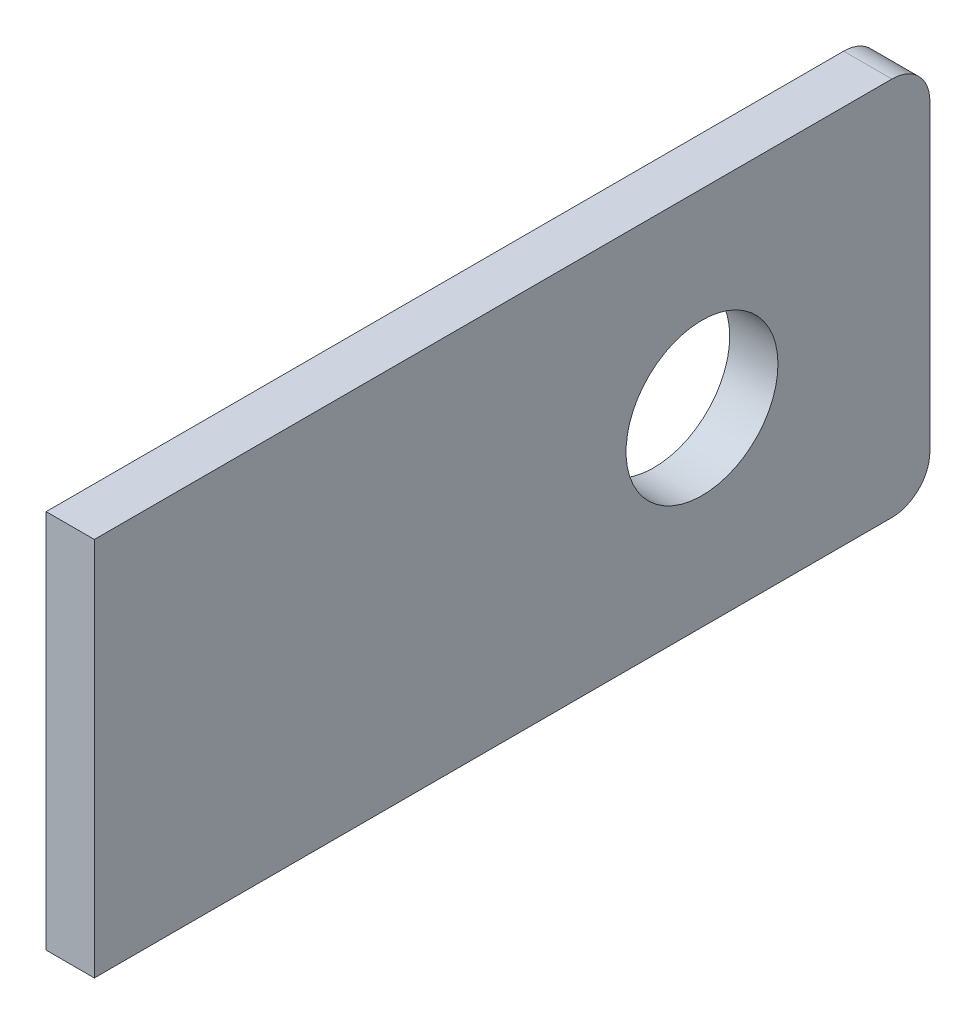
ISO-10303-21;
HEADER;
FILE_DESCRIPTION(('STEP AP214'),'2;1');
FILE_NAME('part.step','',(''),(''),'','','');
FILE_SCHEMA(('AUTOMOTIVE_DESIGN { 1 0 10303 214 1 1 1 1 }'));
ENDSEC;
DATA;
#1=APPLICATION_CONTEXT('core data for automotive mechanical design processes');
#2=APPLICATION_PROTOCOL_DEFINITION('international standard','automotive_design',2000,#1);
#3=PRODUCT_CONTEXT('',#1,'mechanical');
#4=PRODUCT('Part','Part','',(#3));
#5=PRODUCT_RELATED_PRODUCT_CATEGORY('part','',(#4));
#6=PRODUCT_DEFINITION_FORMATION('','',#4);
#7=PRODUCT_DEFINITION_CONTEXT('part definition',#1,'design');
#8=PRODUCT_DEFINITION('design','',#6,#7);
#9=PRODUCT_DEFINITION_SHAPE('','',#8);
#10=(LENGTH_UNIT() NAMED_UNIT(*) SI_UNIT(.MILLI.,.METRE.));
#11=(NAMED_UNIT(*) PLANE_ANGLE_UNIT() SI_UNIT($,.RADIAN.));
#12=(NAMED_UNIT(*) SI_UNIT($,.STERADIAN.) SOLID_ANGLE_UNIT());
#13=UNCERTAINTY_MEASURE_WITH_UNIT(LENGTH_MEASURE(1.E-05),#10,'distance_accuracy_value','');
#14=(GEOMETRIC_REPRESENTATION_CONTEXT(3) GLOBAL_UNCERTAINTY_ASSIGNED_CONTEXT((#13)) GLOBAL_UNIT_ASSIGNED_CONTEXT((#10,
#11,#12)) REPRESENTATION_CONTEXT('',''));
#15=CARTESIAN_POINT('',(0.,0.,0.));
#16=DIRECTION('',(0.,0.,1.));
#17=DIRECTION('',(1.,0.,0.));
#18=AXIS2_PLACEMENT_3D('',#15,#16,#17);
#19=CARTESIAN_POINT('',(3.175,0.,0.));
#20=DIRECTION('',(1.,0.,0.));
#21=DIRECTION('',(0.,0.,-1.));
#22=AXIS2_PLACEMENT_3D('',#19,#20,#21);
#23=PLANE('',#22);
#24=DIRECTION('',(0.,0.,-1.));
#25=VECTOR('',#24,1.);
#26=CARTESIAN_POINT('',(3.175,-25.,80.));
#27=LINE('',#26,#25);
#28=CARTESIAN_POINT('',(3.175,-25.,80.));
#29=VERTEX_POINT('',#28);
#30=CARTESIAN_POINT('',(3.175,-25.,-25.));
#31=VERTEX_POINT('',#30);
#32=EDGE_CURVE('E110',#29,#31,#27,.T.);
#33=ORIENTED_EDGE('',*,*,#32,.T.);
#34=CARTESIAN_POINT('',(3.175,-20.,-25.));
#35=DIRECTION('',(1.,0.,0.));
#36=DIRECTION('',(0.,0.,-1.));
#37=AXIS2_PLACEMENT_3D('',#34,#35,#36);
#38=CIRCLE('',#37,5.);
#39=CARTESIAN_POINT('',(3.175,-20.,-30.));
#40=VERTEX_POINT('',#39);
#41=EDGE_CURVE('E43',#31,#40,#38,.T.);
#42=ORIENTED_EDGE('',*,*,#41,.T.);
#43=DIRECTION('',(0.,1.,0.));
#44=VECTOR('',#43,1.);
#45=CARTESIAN_POINT('',(3.175,25.,-30.));
#46=LINE('',#45,#44);
#47=CARTESIAN_POINT('',(3.175,20.,-30.));
#48=VERTEX_POINT('',#47);
#49=EDGE_CURVE('E96',#40,#48,#46,.T.);
#50=ORIENTED_EDGE('',*,*,#49,.T.);
#51=CARTESIAN_POINT('',(3.175,20.,-25.));
#52=DIRECTION('',(1.,0.,0.));
#53=DIRECTION('',(0.,0.,-1.));
#54=AXIS2_PLACEMENT_3D('',#51,#52,#53);
#55=CIRCLE('',#54,5.);
#56=CARTESIAN_POINT('',(3.175,25.,-25.));
#57=VERTEX_POINT('',#56);
#58=EDGE_CURVE('E50',#48,#57,#55,.T.);
#59=ORIENTED_EDGE('',*,*,#58,.T.);
#60=DIRECTION('',(0.,0.,1.));
#61=VECTOR('',#60,1.);
#62=CARTESIAN_POINT('',(3.175,25.,80.));
#63=LINE('',#62,#61);
#64=CARTESIAN_POINT('',(3.175,25.,80.));
#65=VERTEX_POINT('',#64);
#66=EDGE_CURVE('E88',#57,#65,#63,.T.);
#67=ORIENTED_EDGE('',*,*,#66,.T.);
#68=DIRECTION('',(0.,-1.,0.));
#69=VECTOR('',#68,1.);
#70=CARTESIAN_POINT('',(3.175,25.,80.));
#71=LINE('',#70,#69);
#72=EDGE_CURVE('E92',#65,#29,#71,.T.);
#73=ORIENTED_EDGE('',*,*,#72,.T.);
#74=EDGE_LOOP('',(#33,#42,#50,#59,#67,#73));
#75=FACE_BOUND('',#74,.T.);
#76=CARTESIAN_POINT('',(3.175,0.,0.));
#77=DIRECTION('',(1.,0.,0.));
#78=DIRECTION('',(0.,0.,-1.));
#79=AXIS2_PLACEMENT_3D('',#76,#77,#78);
#80=CIRCLE('',#79,10.);
#81=CARTESIAN_POINT('',(3.175,0.,-10.));
#82=VERTEX_POINT('',#81);
#83=EDGE_CURVE('E118',#82,#82,#80,.T.);
#84=ORIENTED_EDGE('',*,*,#83,.F.);
#85=EDGE_LOOP('',(#84));
#86=FACE_BOUND('',#85,.T.);
#87=ADVANCED_FACE('F35',(#75,#86),#23,.T.);
#88=CARTESIAN_POINT('',(-3.175,0.,0.));
#89=DIRECTION('',(1.,0.,0.));
#90=DIRECTION('',(0.,0.,-1.));
#91=AXIS2_PLACEMENT_3D('',#88,#89,#90);
#92=PLANE('',#91);
#93=DIRECTION('',(0.,1.,0.));
#94=VECTOR('',#93,1.);
#95=CARTESIAN_POINT('',(-3.175,25.,-30.));
#96=LINE('',#95,#94);
#97=CARTESIAN_POINT('',(-3.175,-20.,-30.));
#98=VERTEX_POINT('',#97);
#99=CARTESIAN_POINT('',(-3.175,20.,-30.));
#100=VERTEX_POINT('',#99);
#101=EDGE_CURVE('E115',#98,#100,#96,.T.);
#102=ORIENTED_EDGE('',*,*,#101,.F.);
#103=CARTESIAN_POINT('',(-3.175,-20.,-25.));
#104=DIRECTION('',(1.,0.,0.));
#105=DIRECTION('',(0.,0.,-1.));
#106=AXIS2_PLACEMENT_3D('',#103,#104,#105);
#107=CIRCLE('',#106,5.);
#108=CARTESIAN_POINT('',(-3.175,-25.,-25.));
#109=VERTEX_POINT('',#108);
#110=EDGE_CURVE('E131',#98,#109,#107,.F.);
#111=ORIENTED_EDGE('',*,*,#110,.T.);
#112=DIRECTION('',(0.,0.,-1.));
#113=VECTOR('',#112,1.);
#114=CARTESIAN_POINT('',(-3.175,-25.,80.));
#115=LINE('',#114,#113);
#116=CARTESIAN_POINT('',(-3.175,-25.,80.));
#117=VERTEX_POINT('',#116);
#118=EDGE_CURVE('E122',#117,#109,#115,.T.);
#119=ORIENTED_EDGE('',*,*,#118,.F.);
#120=DIRECTION('',(0.,-1.,0.));
#121=VECTOR('',#120,1.);
#122=CARTESIAN_POINT('',(-3.175,25.,80.));
#123=LINE('',#122,#121);
#124=CARTESIAN_POINT('',(-3.175,25.,80.));
#125=VERTEX_POINT('',#124);
#126=EDGE_CURVE('E120',#125,#117,#123,.T.);
#127=ORIENTED_EDGE('',*,*,#126,.F.);
#128=DIRECTION('',(0.,0.,1.));
#129=VECTOR('',#128,1.);
#130=CARTESIAN_POINT('',(-3.175,25.,80.));
#131=LINE('',#130,#129);
#132=CARTESIAN_POINT('',(-3.175,25.,-25.));
#133=VERTEX_POINT('',#132);
#134=EDGE_CURVE('E102',#133,#125,#131,.T.);
#135=ORIENTED_EDGE('',*,*,#134,.F.);
#136=CARTESIAN_POINT('',(-3.175,20.,-25.));
#137=DIRECTION('',(1.,0.,0.));
#138=DIRECTION('',(0.,0.,-1.));
#139=AXIS2_PLACEMENT_3D('',#136,#137,#138);
#140=CIRCLE('',#139,5.);
#141=EDGE_CURVE('E129',#133,#100,#140,.F.);
#142=ORIENTED_EDGE('',*,*,#141,.T.);
#143=EDGE_LOOP('',(#102,#111,#119,#127,#135,#142));
#144=FACE_BOUND('',#143,.T.);
#145=CARTESIAN_POINT('',(-3.175,0.,0.));
#146=DIRECTION('',(1.,0.,0.));
#147=DIRECTION('',(0.,0.,-1.));
#148=AXIS2_PLACEMENT_3D('',#145,#146,#147);
#149=CIRCLE('',#148,10.);
#150=CARTESIAN_POINT('',(-3.175,0.,-10.));
#151=VERTEX_POINT('',#150);
#152=EDGE_CURVE('E226',#151,#151,#149,.T.);
#153=ORIENTED_EDGE('',*,*,#152,.T.);
#154=EDGE_LOOP('',(#153));
#155=FACE_BOUND('',#154,.T.);
#156=ADVANCED_FACE('F145',(#144,#155),#92,.F.);
#157=CARTESIAN_POINT('',(3.175,25.,-30.));
#158=DIRECTION('',(0.,0.,1.));
#159=DIRECTION('',(0.,-1.,0.));
#160=AXIS2_PLACEMENT_3D('',#157,#158,#159);
#161=PLANE('',#160);
#162=ORIENTED_EDGE('',*,*,#49,.F.);
#163=DIRECTION('',(-1.,0.,0.));
#164=VECTOR('',#163,1.);
#165=CARTESIAN_POINT('',(3.175,-20.,-30.));
#166=LINE('',#165,#164);
#167=EDGE_CURVE('E126',#40,#98,#166,.T.);
#168=ORIENTED_EDGE('',*,*,#167,.T.);
#169=ORIENTED_EDGE('',*,*,#101,.T.);
#170=DIRECTION('',(-1.,0.,0.));
#171=VECTOR('',#170,1.);
#172=CARTESIAN_POINT('',(3.175,20.,-30.));
#173=LINE('',#172,#171);
#174=EDGE_CURVE('E105',#100,#48,#173,.F.);
#175=ORIENTED_EDGE('',*,*,#174,.T.);
#176=EDGE_LOOP('',(#162,#168,#169,#175));
#177=FACE_BOUND('',#176,.T.);
#178=ADVANCED_FACE('F139',(#177),#161,.F.);
#179=CARTESIAN_POINT('',(3.175,25.,80.));
#180=DIRECTION('',(0.,-1.,0.));
#181=DIRECTION('',(0.,0.,-1.));
#182=AXIS2_PLACEMENT_3D('',#179,#180,#181);
#183=PLANE('',#182);
#184=ORIENTED_EDGE('',*,*,#66,.F.);
#185=DIRECTION('',(-1.,0.,0.));
#186=VECTOR('',#185,1.);
#187=CARTESIAN_POINT('',(3.175,25.,-25.));
#188=LINE('',#187,#186);
#189=EDGE_CURVE('E11',#57,#133,#188,.T.);
#190=ORIENTED_EDGE('',*,*,#189,.T.);
#191=ORIENTED_EDGE('',*,*,#134,.T.);
#192=DIRECTION('',(-1.,0.,0.));
#193=VECTOR('',#192,1.);
#194=CARTESIAN_POINT('',(3.175,25.,80.));
#195=LINE('',#194,#193);
#196=EDGE_CURVE('E99',#65,#125,#195,.T.);
#197=ORIENTED_EDGE('',*,*,#196,.F.);
#198=EDGE_LOOP('',(#184,#190,#191,#197));
#199=FACE_BOUND('',#198,.T.);
#200=ADVANCED_FACE('F100',(#199),#183,.F.);
#201=CARTESIAN_POINT('',(3.175,25.,80.));
#202=DIRECTION('',(0.,0.,-1.));
#203=DIRECTION('',(-1.,0.,0.));
#204=AXIS2_PLACEMENT_3D('',#201,#202,#203);
#205=PLANE('',#204);
#206=ORIENTED_EDGE('',*,*,#126,.T.);
#207=DIRECTION('',(-1.,0.,0.));
#208=VECTOR('',#207,1.);
#209=CARTESIAN_POINT('',(3.175,-25.,80.));
#210=LINE('',#209,#208);
#211=EDGE_CURVE('E106',#29,#117,#210,.T.);
#212=ORIENTED_EDGE('',*,*,#211,.F.);
#213=ORIENTED_EDGE('',*,*,#72,.F.);
#214=ORIENTED_EDGE('',*,*,#196,.T.);
#215=EDGE_LOOP('',(#206,#212,#213,#214));
#216=FACE_BOUND('',#215,.T.);
#217=ADVANCED_FACE('F108',(#216),#205,.F.);
#218=CARTESIAN_POINT('',(3.175,-25.,80.));
#219=DIRECTION('',(0.,1.,0.));
#220=DIRECTION('',(0.,0.,1.));
#221=AXIS2_PLACEMENT_3D('',#218,#219,#220);
#222=PLANE('',#221);
#223=ORIENTED_EDGE('',*,*,#118,.T.);
#224=DIRECTION('',(-1.,0.,0.));
#225=VECTOR('',#224,1.);
#226=CARTESIAN_POINT('',(3.175,-25.,-25.));
#227=LINE('',#226,#225);
#228=EDGE_CURVE('E58',#109,#31,#227,.F.);
#229=ORIENTED_EDGE('',*,*,#228,.T.);
#230=ORIENTED_EDGE('',*,*,#32,.F.);
#231=ORIENTED_EDGE('',*,*,#211,.T.);
#232=EDGE_LOOP('',(#223,#229,#230,#231));
#233=FACE_BOUND('',#232,.T.);
#234=ADVANCED_FACE('F147',(#233),#222,.F.);
#235=CARTESIAN_POINT('',(3.175,0.,0.));
#236=DIRECTION('',(-1.,0.,0.));
#237=DIRECTION('',(0.,0.,1.));
#238=AXIS2_PLACEMENT_3D('',#235,#236,#237);
#239=CYLINDRICAL_SURFACE('',#238,10.);
#240=ORIENTED_EDGE('',*,*,#83,.T.);
#241=EDGE_LOOP('',(#240));
#242=FACE_BOUND('',#241,.T.);
#243=ORIENTED_EDGE('',*,*,#152,.F.);
#244=EDGE_LOOP('',(#243));
#245=FACE_BOUND('',#244,.T.);
#246=ADVANCED_FACE('F149',(#242,#245),#239,.F.);
#247=CARTESIAN_POINT('',(3.175,-20.,-25.));
#248=DIRECTION('',(-1.,0.,0.));
#249=DIRECTION('',(0.,0.,1.));
#250=AXIS2_PLACEMENT_3D('',#247,#248,#249);
#251=CYLINDRICAL_SURFACE('',#250,5.);
#252=ORIENTED_EDGE('',*,*,#41,.F.);
#253=ORIENTED_EDGE('',*,*,#228,.F.);
#254=ORIENTED_EDGE('',*,*,#110,.F.);
#255=ORIENTED_EDGE('',*,*,#167,.F.);
#256=EDGE_LOOP('',(#252,#253,#254,#255));
#257=FACE_BOUND('',#256,.T.);
#258=ADVANCED_FACE('F142',(#257),#251,.T.);
#259=CARTESIAN_POINT('',(3.175,20.,-25.));
#260=DIRECTION('',(-1.,0.,0.));
#261=DIRECTION('',(0.,0.,1.));
#262=AXIS2_PLACEMENT_3D('',#259,#260,#261);
#263=CYLINDRICAL_SURFACE('',#262,5.);
#264=ORIENTED_EDGE('',*,*,#58,.F.);
#265=ORIENTED_EDGE('',*,*,#174,.F.);
#266=ORIENTED_EDGE('',*,*,#141,.F.);
#267=ORIENTED_EDGE('',*,*,#189,.F.);
#268=EDGE_LOOP('',(#264,#265,#266,#267));
#269=FACE_BOUND('',#268,.T.);
#270=ADVANCED_FACE('F37',(#269),#263,.T.);
#271=CLOSED_SHELL('',(#87,#156,#178,#200,#217,#234,#246,#258,#270));
#272=MANIFOLD_SOLID_BREP('B2',#271);
#273=ADVANCED_BREP_SHAPE_REPRESENTATION('',(#18,#272),#14);
#274=SHAPE_DEFINITION_REPRESENTATION(#9,#273);
ENDSEC;
END-ISO-10303-21;
